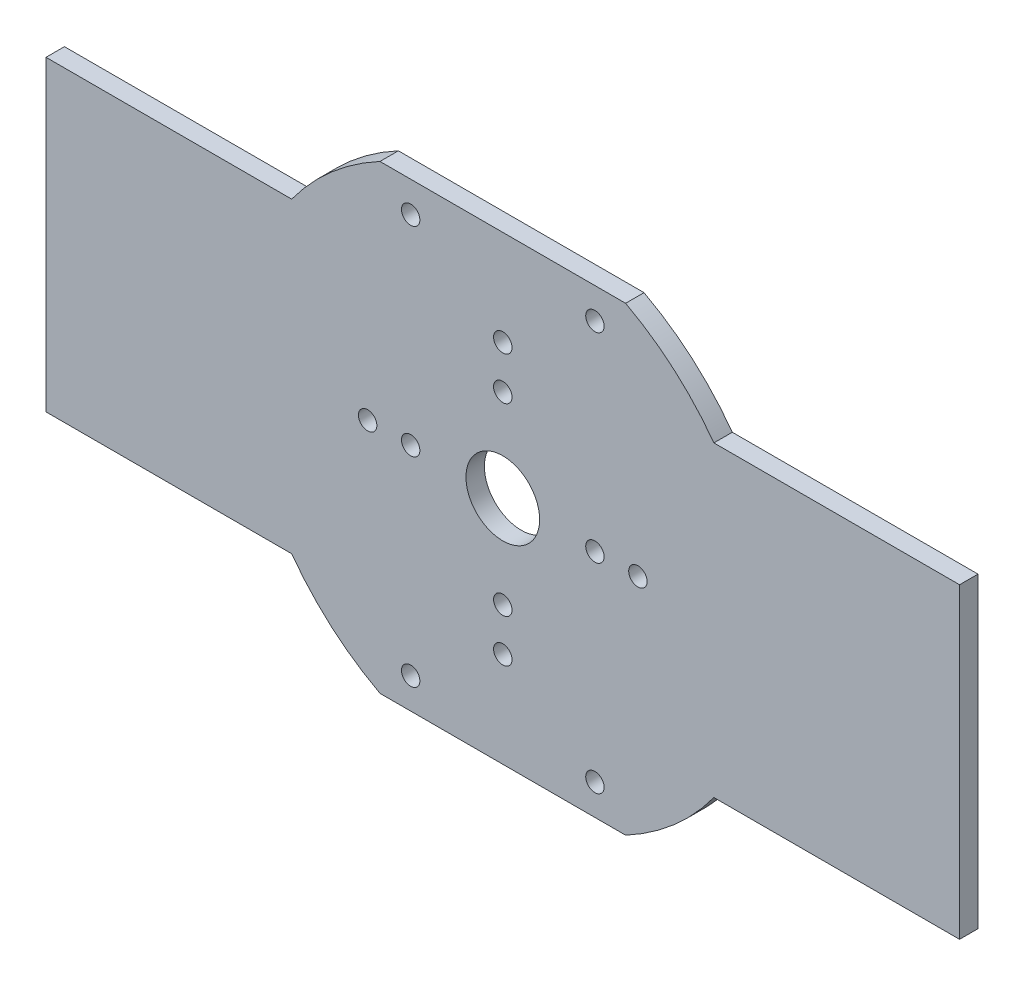
ISO-10303-21;
HEADER;
FILE_DESCRIPTION(('STEP AP214'),'2;1');
FILE_NAME('part.step','',(''),(''),'','','');
FILE_SCHEMA(('AUTOMOTIVE_DESIGN { 1 0 10303 214 1 1 1 1 }'));
ENDSEC;
DATA;
#1=APPLICATION_CONTEXT('core data for automotive mechanical design processes');
#2=APPLICATION_PROTOCOL_DEFINITION('international standard','automotive_design',2000,#1);
#3=PRODUCT_CONTEXT('',#1,'mechanical');
#4=PRODUCT('Part','Part','',(#3));
#5=PRODUCT_RELATED_PRODUCT_CATEGORY('part','',(#4));
#6=PRODUCT_DEFINITION_FORMATION('','',#4);
#7=PRODUCT_DEFINITION_CONTEXT('part definition',#1,'design');
#8=PRODUCT_DEFINITION('design','',#6,#7);
#9=PRODUCT_DEFINITION_SHAPE('','',#8);
#10=(LENGTH_UNIT() NAMED_UNIT(*) SI_UNIT(.MILLI.,.METRE.));
#11=(NAMED_UNIT(*) PLANE_ANGLE_UNIT() SI_UNIT($,.RADIAN.));
#12=(NAMED_UNIT(*) SI_UNIT($,.STERADIAN.) SOLID_ANGLE_UNIT());
#13=UNCERTAINTY_MEASURE_WITH_UNIT(LENGTH_MEASURE(1.E-05),#10,'distance_accuracy_value','');
#14=(GEOMETRIC_REPRESENTATION_CONTEXT(3) GLOBAL_UNCERTAINTY_ASSIGNED_CONTEXT((#13)) GLOBAL_UNIT_ASSIGNED_CONTEXT((#10,
#11,#12)) REPRESENTATION_CONTEXT('',''));
#15=CARTESIAN_POINT('',(0.,0.,0.));
#16=DIRECTION('',(0.,0.,1.));
#17=DIRECTION('',(1.,0.,0.));
#18=AXIS2_PLACEMENT_3D('',#15,#16,#17);
#19=CARTESIAN_POINT('',(20.,-37.5,1.5));
#20=DIRECTION('',(0.,0.,-1.));
#21=DIRECTION('',(-1.,0.,0.));
#22=AXIS2_PLACEMENT_3D('',#19,#20,#21);
#23=CYLINDRICAL_SURFACE('',#22,42.5);
#24=DIRECTION('',(0.,0.,1.));
#25=VECTOR('',#24,1.);
#26=CARTESIAN_POINT('',(-14.3693177121688,-12.5,-3.5));
#27=LINE('',#26,#25);
#28=CARTESIAN_POINT('',(-14.3693177121688,-12.5,-1.5));
#29=VERTEX_POINT('',#28);
#30=CARTESIAN_POINT('',(-14.3693177121688,-12.5,1.5));
#31=VERTEX_POINT('',#30);
#32=EDGE_CURVE('E160',#29,#31,#27,.T.);
#33=ORIENTED_EDGE('',*,*,#32,.T.);
#34=CARTESIAN_POINT('',(20.,-37.5,1.5));
#35=DIRECTION('',(0.,0.,1.));
#36=DIRECTION('',(1.,0.,0.));
#37=AXIS2_PLACEMENT_3D('',#34,#35,#36);
#38=CIRCLE('',#37,42.5);
#39=CARTESIAN_POINT('',(0.,0.,1.5));
#40=VERTEX_POINT('',#39);
#41=EDGE_CURVE('E11',#40,#31,#38,.T.);
#42=ORIENTED_EDGE('',*,*,#41,.F.);
#43=DIRECTION('',(0.,0.,1.));
#44=VECTOR('',#43,1.);
#45=CARTESIAN_POINT('',(0.,0.,-1.5));
#46=LINE('',#45,#44);
#47=CARTESIAN_POINT('',(0.,0.,-1.5));
#48=VERTEX_POINT('',#47);
#49=EDGE_CURVE('E335',#48,#40,#46,.T.);
#50=ORIENTED_EDGE('',*,*,#49,.F.);
#51=CARTESIAN_POINT('',(20.,-37.5,-1.5));
#52=DIRECTION('',(0.,0.,1.));
#53=DIRECTION('',(1.,0.,0.));
#54=AXIS2_PLACEMENT_3D('',#51,#52,#53);
#55=CIRCLE('',#54,42.5);
#56=EDGE_CURVE('E44',#48,#29,#55,.T.);
#57=ORIENTED_EDGE('',*,*,#56,.T.);
#58=EDGE_LOOP('',(#33,#42,#50,#57));
#59=FACE_BOUND('',#58,.T.);
#60=ADVANCED_FACE('F41',(#59),#23,.T.);
#61=DIRECTION('',(0.,0.,1.));
#62=VECTOR('',#61,1.);
#63=CARTESIAN_POINT('',(-14.3693177121688,-62.5,-3.5));
#64=LINE('',#63,#62);
#65=CARTESIAN_POINT('',(-14.3693177121688,-62.5,-1.5));
#66=VERTEX_POINT('',#65);
#67=CARTESIAN_POINT('',(-14.3693177121688,-62.5,1.5));
#68=VERTEX_POINT('',#67);
#69=EDGE_CURVE('E197',#66,#68,#64,.T.);
#70=ORIENTED_EDGE('',*,*,#69,.F.);
#71=CARTESIAN_POINT('',(0.,-75.,-1.5));
#72=VERTEX_POINT('',#71);
#73=EDGE_CURVE('E59',#66,#72,#55,.T.);
#74=ORIENTED_EDGE('',*,*,#73,.T.);
#75=DIRECTION('',(0.,0.,1.));
#76=VECTOR('',#75,1.);
#77=CARTESIAN_POINT('',(0.,-75.,-1.5));
#78=LINE('',#77,#76);
#79=CARTESIAN_POINT('',(0.,-75.,1.5));
#80=VERTEX_POINT('',#79);
#81=EDGE_CURVE('E317',#72,#80,#78,.T.);
#82=ORIENTED_EDGE('',*,*,#81,.T.);
#83=EDGE_CURVE('E50',#68,#80,#38,.T.);
#84=ORIENTED_EDGE('',*,*,#83,.F.);
#85=EDGE_LOOP('',(#70,#74,#82,#84));
#86=FACE_BOUND('',#85,.T.);
#87=ADVANCED_FACE('F376',(#86),#23,.T.);
#88=DIRECTION('',(0.,0.,1.));
#89=VECTOR('',#88,1.);
#90=CARTESIAN_POINT('',(54.3693177121688,-62.5,-3.5));
#91=LINE('',#90,#89);
#92=CARTESIAN_POINT('',(54.3693177121688,-62.5,-1.5));
#93=VERTEX_POINT('',#92);
#94=CARTESIAN_POINT('',(54.3693177121688,-62.5,1.5));
#95=VERTEX_POINT('',#94);
#96=EDGE_CURVE('E196',#93,#95,#91,.T.);
#97=ORIENTED_EDGE('',*,*,#96,.T.);
#98=CARTESIAN_POINT('',(40.,-75.,1.5));
#99=VERTEX_POINT('',#98);
#100=EDGE_CURVE('E52',#99,#95,#38,.T.);
#101=ORIENTED_EDGE('',*,*,#100,.F.);
#102=DIRECTION('',(0.,0.,1.));
#103=VECTOR('',#102,1.);
#104=CARTESIAN_POINT('',(40.,-75.,-1.5));
#105=LINE('',#104,#103);
#106=CARTESIAN_POINT('',(40.,-75.,-1.5));
#107=VERTEX_POINT('',#106);
#108=EDGE_CURVE('E321',#107,#99,#105,.T.);
#109=ORIENTED_EDGE('',*,*,#108,.F.);
#110=EDGE_CURVE('E348',#107,#93,#55,.T.);
#111=ORIENTED_EDGE('',*,*,#110,.T.);
#112=EDGE_LOOP('',(#97,#101,#109,#111));
#113=FACE_BOUND('',#112,.T.);
#114=ADVANCED_FACE('F357',(#113),#23,.T.);
#115=DIRECTION('',(0.,0.,1.));
#116=VECTOR('',#115,1.);
#117=CARTESIAN_POINT('',(54.3693177121688,-12.5,-3.5));
#118=LINE('',#117,#116);
#119=CARTESIAN_POINT('',(54.3693177121688,-12.5,-1.5));
#120=VERTEX_POINT('',#119);
#121=CARTESIAN_POINT('',(54.3693177121688,-12.5,1.5));
#122=VERTEX_POINT('',#121);
#123=EDGE_CURVE('E204',#120,#122,#118,.T.);
#124=ORIENTED_EDGE('',*,*,#123,.F.);
#125=CARTESIAN_POINT('',(40.,0.,-1.5));
#126=VERTEX_POINT('',#125);
#127=EDGE_CURVE('E67',#120,#126,#55,.T.);
#128=ORIENTED_EDGE('',*,*,#127,.T.);
#129=DIRECTION('',(0.,0.,1.));
#130=VECTOR('',#129,1.);
#131=CARTESIAN_POINT('',(40.,0.,-1.5));
#132=LINE('',#131,#130);
#133=CARTESIAN_POINT('',(40.,0.,1.5));
#134=VERTEX_POINT('',#133);
#135=EDGE_CURVE('E331',#126,#134,#132,.T.);
#136=ORIENTED_EDGE('',*,*,#135,.T.);
#137=EDGE_CURVE('E51',#122,#134,#38,.T.);
#138=ORIENTED_EDGE('',*,*,#137,.F.);
#139=EDGE_LOOP('',(#124,#128,#136,#138));
#140=FACE_BOUND('',#139,.T.);
#141=ADVANCED_FACE('F340',(#140),#23,.T.);
#142=CARTESIAN_POINT('',(20.,-37.5,1.5));
#143=DIRECTION('',(0.,0.,1.));
#144=DIRECTION('',(1.,0.,0.));
#145=AXIS2_PLACEMENT_3D('',#142,#143,#144);
#146=PLANE('',#145);
#147=CARTESIAN_POINT('',(20.,-37.5,1.5));
#148=DIRECTION('',(0.,0.,1.));
#149=DIRECTION('',(1.,0.,0.));
#150=AXIS2_PLACEMENT_3D('',#147,#148,#149);
#151=CIRCLE('',#150,6.);
#152=CARTESIAN_POINT('',(26.,-37.5,1.5));
#153=VERTEX_POINT('',#152);
#154=EDGE_CURVE('E201',#153,#153,#151,.T.);
#155=ORIENTED_EDGE('',*,*,#154,.F.);
#156=EDGE_LOOP('',(#155));
#157=FACE_BOUND('',#156,.T.);
#158=CARTESIAN_POINT('',(20.,-15.5,1.5));
#159=DIRECTION('',(0.,0.,1.));
#160=DIRECTION('',(1.,0.,0.));
#161=AXIS2_PLACEMENT_3D('',#158,#159,#160);
#162=CIRCLE('',#161,1.5);
#163=CARTESIAN_POINT('',(21.5,-15.5,1.5));
#164=VERTEX_POINT('',#163);
#165=EDGE_CURVE('E223',#164,#164,#162,.T.);
#166=ORIENTED_EDGE('',*,*,#165,.F.);
#167=EDGE_LOOP('',(#166));
#168=FACE_BOUND('',#167,.T.);
#169=CARTESIAN_POINT('',(35.,-37.5,1.5));
#170=DIRECTION('',(0.,0.,1.));
#171=DIRECTION('',(1.,0.,0.));
#172=AXIS2_PLACEMENT_3D('',#169,#170,#171);
#173=CIRCLE('',#172,1.5);
#174=CARTESIAN_POINT('',(36.5,-37.5,1.5));
#175=VERTEX_POINT('',#174);
#176=EDGE_CURVE('E214',#175,#175,#173,.T.);
#177=ORIENTED_EDGE('',*,*,#176,.F.);
#178=EDGE_LOOP('',(#177));
#179=FACE_BOUND('',#178,.T.);
#180=CARTESIAN_POINT('',(20.,-52.5,1.5));
#181=DIRECTION('',(0.,0.,1.));
#182=DIRECTION('',(1.,0.,0.));
#183=AXIS2_PLACEMENT_3D('',#180,#181,#182);
#184=CIRCLE('',#183,1.5);
#185=CARTESIAN_POINT('',(21.5,-52.5,1.5));
#186=VERTEX_POINT('',#185);
#187=EDGE_CURVE('E241',#186,#186,#184,.T.);
#188=ORIENTED_EDGE('',*,*,#187,.F.);
#189=EDGE_LOOP('',(#188));
#190=FACE_BOUND('',#189,.T.);
#191=CARTESIAN_POINT('',(5.,-37.5,1.5));
#192=DIRECTION('',(0.,0.,1.));
#193=DIRECTION('',(1.,0.,0.));
#194=AXIS2_PLACEMENT_3D('',#191,#192,#193);
#195=CIRCLE('',#194,1.5);
#196=CARTESIAN_POINT('',(6.5,-37.5,1.5));
#197=VERTEX_POINT('',#196);
#198=EDGE_CURVE('E233',#197,#197,#195,.T.);
#199=ORIENTED_EDGE('',*,*,#198,.F.);
#200=EDGE_LOOP('',(#199));
#201=FACE_BOUND('',#200,.T.);
#202=CARTESIAN_POINT('',(-1.99999999999999,-37.5,1.5));
#203=DIRECTION('',(0.,0.,1.));
#204=DIRECTION('',(1.,0.,0.));
#205=AXIS2_PLACEMENT_3D('',#202,#203,#204);
#206=CIRCLE('',#205,1.5);
#207=CARTESIAN_POINT('',(-0.499999999999994,-37.5,1.5));
#208=VERTEX_POINT('',#207);
#209=EDGE_CURVE('E271',#208,#208,#206,.T.);
#210=ORIENTED_EDGE('',*,*,#209,.F.);
#211=EDGE_LOOP('',(#210));
#212=FACE_BOUND('',#211,.T.);
#213=CARTESIAN_POINT('',(42.,-37.5,1.5));
#214=DIRECTION('',(0.,0.,1.));
#215=DIRECTION('',(1.,0.,0.));
#216=AXIS2_PLACEMENT_3D('',#213,#214,#215);
#217=CIRCLE('',#216,1.5);
#218=CARTESIAN_POINT('',(43.5,-37.5,1.5));
#219=VERTEX_POINT('',#218);
#220=EDGE_CURVE('E256',#219,#219,#217,.T.);
#221=ORIENTED_EDGE('',*,*,#220,.F.);
#222=EDGE_LOOP('',(#221));
#223=FACE_BOUND('',#222,.T.);
#224=CARTESIAN_POINT('',(20.,-59.5,1.5));
#225=DIRECTION('',(0.,0.,1.));
#226=DIRECTION('',(1.,0.,0.));
#227=AXIS2_PLACEMENT_3D('',#224,#225,#226);
#228=CIRCLE('',#227,1.5);
#229=CARTESIAN_POINT('',(21.5,-59.5,1.5));
#230=VERTEX_POINT('',#229);
#231=EDGE_CURVE('E257',#230,#230,#228,.T.);
#232=ORIENTED_EDGE('',*,*,#231,.F.);
#233=EDGE_LOOP('',(#232));
#234=FACE_BOUND('',#233,.T.);
#235=CARTESIAN_POINT('',(20.,-22.5,1.5));
#236=DIRECTION('',(0.,0.,1.));
#237=DIRECTION('',(1.,0.,0.));
#238=AXIS2_PLACEMENT_3D('',#235,#236,#237);
#239=CIRCLE('',#238,1.5);
#240=CARTESIAN_POINT('',(21.5,-22.5,1.5));
#241=VERTEX_POINT('',#240);
#242=EDGE_CURVE('E232',#241,#241,#239,.T.);
#243=ORIENTED_EDGE('',*,*,#242,.F.);
#244=EDGE_LOOP('',(#243));
#245=FACE_BOUND('',#244,.T.);
#246=CARTESIAN_POINT('',(35.,-70.,1.5));
#247=DIRECTION('',(0.,0.,1.));
#248=DIRECTION('',(1.,0.,0.));
#249=AXIS2_PLACEMENT_3D('',#246,#247,#248);
#250=CIRCLE('',#249,1.5);
#251=CARTESIAN_POINT('',(36.5,-70.,1.5));
#252=VERTEX_POINT('',#251);
#253=EDGE_CURVE('E222',#252,#252,#250,.T.);
#254=ORIENTED_EDGE('',*,*,#253,.F.);
#255=EDGE_LOOP('',(#254));
#256=FACE_BOUND('',#255,.T.);
#257=CARTESIAN_POINT('',(5.,-70.,1.5));
#258=DIRECTION('',(0.,0.,1.));
#259=DIRECTION('',(1.,0.,0.));
#260=AXIS2_PLACEMENT_3D('',#257,#258,#259);
#261=CIRCLE('',#260,1.5);
#262=CARTESIAN_POINT('',(6.5,-70.,1.5));
#263=VERTEX_POINT('',#262);
#264=EDGE_CURVE('E286',#263,#263,#261,.T.);
#265=ORIENTED_EDGE('',*,*,#264,.F.);
#266=EDGE_LOOP('',(#265));
#267=FACE_BOUND('',#266,.T.);
#268=CARTESIAN_POINT('',(35.,-5.,1.5));
#269=DIRECTION('',(0.,0.,1.));
#270=DIRECTION('',(1.,0.,0.));
#271=AXIS2_PLACEMENT_3D('',#268,#269,#270);
#272=CIRCLE('',#271,1.5);
#273=CARTESIAN_POINT('',(36.5,-5.,1.5));
#274=VERTEX_POINT('',#273);
#275=EDGE_CURVE('E294',#274,#274,#272,.T.);
#276=ORIENTED_EDGE('',*,*,#275,.F.);
#277=EDGE_LOOP('',(#276));
#278=FACE_BOUND('',#277,.T.);
#279=CARTESIAN_POINT('',(5.,-5.,1.5));
#280=DIRECTION('',(0.,0.,1.));
#281=DIRECTION('',(1.,0.,0.));
#282=AXIS2_PLACEMENT_3D('',#279,#280,#281);
#283=CIRCLE('',#282,1.5);
#284=CARTESIAN_POINT('',(6.5,-5.,1.5));
#285=VERTEX_POINT('',#284);
#286=EDGE_CURVE('E302',#285,#285,#283,.T.);
#287=ORIENTED_EDGE('',*,*,#286,.F.);
#288=EDGE_LOOP('',(#287));
#289=FACE_BOUND('',#288,.T.);
#290=ORIENTED_EDGE('',*,*,#41,.T.);
#291=DIRECTION('',(1.,0.,0.));
#292=VECTOR('',#291,1.);
#293=CARTESIAN_POINT('',(-54.3693177121688,-12.5,1.5));
#294=LINE('',#293,#292);
#295=CARTESIAN_POINT('',(-54.3693177121688,-12.5,1.5));
#296=VERTEX_POINT('',#295);
#297=EDGE_CURVE('E639',#296,#31,#294,.T.);
#298=ORIENTED_EDGE('',*,*,#297,.F.);
#299=DIRECTION('',(0.,1.,0.));
#300=VECTOR('',#299,1.);
#301=CARTESIAN_POINT('',(-54.3693177121688,-62.5,1.5));
#302=LINE('',#301,#300);
#303=CARTESIAN_POINT('',(-54.3693177121688,-62.5,1.5));
#304=VERTEX_POINT('',#303);
#305=EDGE_CURVE('E153',#304,#296,#302,.T.);
#306=ORIENTED_EDGE('',*,*,#305,.F.);
#307=DIRECTION('',(1.,0.,0.));
#308=VECTOR('',#307,1.);
#309=CARTESIAN_POINT('',(-54.3693177121688,-62.5,1.5));
#310=LINE('',#309,#308);
#311=EDGE_CURVE('E170',#304,#68,#310,.T.);
#312=ORIENTED_EDGE('',*,*,#311,.T.);
#313=ORIENTED_EDGE('',*,*,#83,.T.);
#314=DIRECTION('',(1.,0.,0.));
#315=VECTOR('',#314,1.);
#316=CARTESIAN_POINT('',(0.,-75.,1.5));
#317=LINE('',#316,#315);
#318=EDGE_CURVE('E310',#80,#99,#317,.T.);
#319=ORIENTED_EDGE('',*,*,#318,.T.);
#320=ORIENTED_EDGE('',*,*,#100,.T.);
#321=DIRECTION('',(-1.,0.,0.));
#322=VECTOR('',#321,1.);
#323=CARTESIAN_POINT('',(94.3693177121688,-62.5,1.5));
#324=LINE('',#323,#322);
#325=CARTESIAN_POINT('',(94.3693177121688,-62.5,1.5));
#326=VERTEX_POINT('',#325);
#327=EDGE_CURVE('E189',#326,#95,#324,.T.);
#328=ORIENTED_EDGE('',*,*,#327,.F.);
#329=DIRECTION('',(0.,-1.,0.));
#330=VECTOR('',#329,1.);
#331=CARTESIAN_POINT('',(94.3693177121688,-12.5,1.5));
#332=LINE('',#331,#330);
#333=CARTESIAN_POINT('',(94.3693177121688,-12.5,1.5));
#334=VERTEX_POINT('',#333);
#335=EDGE_CURVE('E168',#334,#326,#332,.T.);
#336=ORIENTED_EDGE('',*,*,#335,.F.);
#337=DIRECTION('',(-1.,0.,0.));
#338=VECTOR('',#337,1.);
#339=CARTESIAN_POINT('',(94.3693177121688,-12.5,1.5));
#340=LINE('',#339,#338);
#341=EDGE_CURVE('E192',#334,#122,#340,.T.);
#342=ORIENTED_EDGE('',*,*,#341,.T.);
#343=ORIENTED_EDGE('',*,*,#137,.T.);
#344=DIRECTION('',(1.,0.,0.));
#345=VECTOR('',#344,1.);
#346=CARTESIAN_POINT('',(0.,0.,1.5));
#347=LINE('',#346,#345);
#348=EDGE_CURVE('E324',#40,#134,#347,.T.);
#349=ORIENTED_EDGE('',*,*,#348,.F.);
#350=EDGE_LOOP('',(#290,#298,#306,#312,#313,#319,#320,#328,#336,#342,#343,#349));
#351=FACE_BOUND('',#350,.T.);
#352=ADVANCED_FACE('F368',(#157,#168,#179,#190,#201,#212,#223,#234,#245,#256,#267,#278,#289,
#351),#146,.T.);
#353=CARTESIAN_POINT('',(20.,-37.5,-1.5));
#354=DIRECTION('',(0.,0.,1.));
#355=DIRECTION('',(1.,0.,0.));
#356=AXIS2_PLACEMENT_3D('',#353,#354,#355);
#357=PLANE('',#356);
#358=CARTESIAN_POINT('',(20.,-37.5,-1.5));
#359=DIRECTION('',(0.,0.,1.));
#360=DIRECTION('',(1.,0.,0.));
#361=AXIS2_PLACEMENT_3D('',#358,#359,#360);
#362=CIRCLE('',#361,6.);
#363=CARTESIAN_POINT('',(26.,-37.5,-1.5));
#364=VERTEX_POINT('',#363);
#365=EDGE_CURVE('E210',#364,#364,#362,.T.);
#366=ORIENTED_EDGE('',*,*,#365,.T.);
#367=EDGE_LOOP('',(#366));
#368=FACE_BOUND('',#367,.T.);
#369=CARTESIAN_POINT('',(20.,-15.5,-1.5));
#370=DIRECTION('',(0.,0.,1.));
#371=DIRECTION('',(1.,0.,0.));
#372=AXIS2_PLACEMENT_3D('',#369,#370,#371);
#373=CIRCLE('',#372,1.5);
#374=CARTESIAN_POINT('',(21.5,-15.5,-1.5));
#375=VERTEX_POINT('',#374);
#376=EDGE_CURVE('E218',#375,#375,#373,.T.);
#377=ORIENTED_EDGE('',*,*,#376,.T.);
#378=EDGE_LOOP('',(#377));
#379=FACE_BOUND('',#378,.T.);
#380=CARTESIAN_POINT('',(35.,-37.5,-1.5));
#381=DIRECTION('',(0.,0.,1.));
#382=DIRECTION('',(1.,0.,0.));
#383=AXIS2_PLACEMENT_3D('',#380,#381,#382);
#384=CIRCLE('',#383,1.5);
#385=CARTESIAN_POINT('',(36.5,-37.5,-1.5));
#386=VERTEX_POINT('',#385);
#387=EDGE_CURVE('E245',#386,#386,#384,.T.);
#388=ORIENTED_EDGE('',*,*,#387,.T.);
#389=EDGE_LOOP('',(#388));
#390=FACE_BOUND('',#389,.T.);
#391=CARTESIAN_POINT('',(20.,-52.5,-1.5));
#392=DIRECTION('',(0.,0.,1.));
#393=DIRECTION('',(1.,0.,0.));
#394=AXIS2_PLACEMENT_3D('',#391,#392,#393);
#395=CIRCLE('',#394,1.5);
#396=CARTESIAN_POINT('',(21.5,-52.5,-1.5));
#397=VERTEX_POINT('',#396);
#398=EDGE_CURVE('E237',#397,#397,#395,.T.);
#399=ORIENTED_EDGE('',*,*,#398,.T.);
#400=EDGE_LOOP('',(#399));
#401=FACE_BOUND('',#400,.T.);
#402=CARTESIAN_POINT('',(5.,-37.5,-1.5));
#403=DIRECTION('',(0.,0.,1.));
#404=DIRECTION('',(1.,0.,0.));
#405=AXIS2_PLACEMENT_3D('',#402,#403,#404);
#406=CIRCLE('',#405,1.5);
#407=CARTESIAN_POINT('',(6.5,-37.5,-1.5));
#408=VERTEX_POINT('',#407);
#409=EDGE_CURVE('E228',#408,#408,#406,.T.);
#410=ORIENTED_EDGE('',*,*,#409,.T.);
#411=EDGE_LOOP('',(#410));
#412=FACE_BOUND('',#411,.T.);
#413=CARTESIAN_POINT('',(-1.99999999999999,-37.5,-1.5));
#414=DIRECTION('',(0.,0.,1.));
#415=DIRECTION('',(1.,0.,0.));
#416=AXIS2_PLACEMENT_3D('',#413,#414,#415);
#417=CIRCLE('',#416,1.5);
#418=CARTESIAN_POINT('',(-0.499999999999994,-37.5,-1.5));
#419=VERTEX_POINT('',#418);
#420=EDGE_CURVE('E227',#419,#419,#417,.T.);
#421=ORIENTED_EDGE('',*,*,#420,.T.);
#422=EDGE_LOOP('',(#421));
#423=FACE_BOUND('',#422,.T.);
#424=CARTESIAN_POINT('',(42.,-37.5,-1.5));
#425=DIRECTION('',(0.,0.,1.));
#426=DIRECTION('',(1.,0.,0.));
#427=AXIS2_PLACEMENT_3D('',#424,#425,#426);
#428=CIRCLE('',#427,1.5);
#429=CARTESIAN_POINT('',(43.5,-37.5,-1.5));
#430=VERTEX_POINT('',#429);
#431=EDGE_CURVE('E275',#430,#430,#428,.T.);
#432=ORIENTED_EDGE('',*,*,#431,.T.);
#433=EDGE_LOOP('',(#432));
#434=FACE_BOUND('',#433,.T.);
#435=CARTESIAN_POINT('',(20.,-59.5,-1.5));
#436=DIRECTION('',(0.,0.,1.));
#437=DIRECTION('',(1.,0.,0.));
#438=AXIS2_PLACEMENT_3D('',#435,#436,#437);
#439=CIRCLE('',#438,1.5);
#440=CARTESIAN_POINT('',(21.5,-59.5,-1.5));
#441=VERTEX_POINT('',#440);
#442=EDGE_CURVE('E252',#441,#441,#439,.T.);
#443=ORIENTED_EDGE('',*,*,#442,.T.);
#444=EDGE_LOOP('',(#443));
#445=FACE_BOUND('',#444,.T.);
#446=CARTESIAN_POINT('',(20.,-22.5,-1.5));
#447=DIRECTION('',(0.,0.,1.));
#448=DIRECTION('',(1.,0.,0.));
#449=AXIS2_PLACEMENT_3D('',#446,#447,#448);
#450=CIRCLE('',#449,1.5);
#451=CARTESIAN_POINT('',(21.5,-22.5,-1.5));
#452=VERTEX_POINT('',#451);
#453=EDGE_CURVE('E261',#452,#452,#450,.T.);
#454=ORIENTED_EDGE('',*,*,#453,.T.);
#455=EDGE_LOOP('',(#454));
#456=FACE_BOUND('',#455,.T.);
#457=CARTESIAN_POINT('',(35.,-70.,-1.5));
#458=DIRECTION('',(0.,0.,1.));
#459=DIRECTION('',(1.,0.,0.));
#460=AXIS2_PLACEMENT_3D('',#457,#458,#459);
#461=CIRCLE('',#460,1.5);
#462=CARTESIAN_POINT('',(36.5,-70.,-1.5));
#463=VERTEX_POINT('',#462);
#464=EDGE_CURVE('E282',#463,#463,#461,.T.);
#465=ORIENTED_EDGE('',*,*,#464,.T.);
#466=EDGE_LOOP('',(#465));
#467=FACE_BOUND('',#466,.T.);
#468=CARTESIAN_POINT('',(5.,-70.,-1.5));
#469=DIRECTION('',(0.,0.,1.));
#470=DIRECTION('',(1.,0.,0.));
#471=AXIS2_PLACEMENT_3D('',#468,#469,#470);
#472=CIRCLE('',#471,1.5);
#473=CARTESIAN_POINT('',(6.5,-70.,-1.5));
#474=VERTEX_POINT('',#473);
#475=EDGE_CURVE('E290',#474,#474,#472,.T.);
#476=ORIENTED_EDGE('',*,*,#475,.T.);
#477=EDGE_LOOP('',(#476));
#478=FACE_BOUND('',#477,.T.);
#479=CARTESIAN_POINT('',(35.,-5.,-1.5));
#480=DIRECTION('',(0.,0.,1.));
#481=DIRECTION('',(1.,0.,0.));
#482=AXIS2_PLACEMENT_3D('',#479,#480,#481);
#483=CIRCLE('',#482,1.5);
#484=CARTESIAN_POINT('',(36.5,-5.,-1.5));
#485=VERTEX_POINT('',#484);
#486=EDGE_CURVE('E298',#485,#485,#483,.T.);
#487=ORIENTED_EDGE('',*,*,#486,.T.);
#488=EDGE_LOOP('',(#487));
#489=FACE_BOUND('',#488,.T.);
#490=CARTESIAN_POINT('',(5.,-5.,-1.5));
#491=DIRECTION('',(0.,0.,1.));
#492=DIRECTION('',(1.,0.,0.));
#493=AXIS2_PLACEMENT_3D('',#490,#491,#492);
#494=CIRCLE('',#493,1.5);
#495=CARTESIAN_POINT('',(6.5,-5.,-1.5));
#496=VERTEX_POINT('',#495);
#497=EDGE_CURVE('E306',#496,#496,#494,.T.);
#498=ORIENTED_EDGE('',*,*,#497,.T.);
#499=EDGE_LOOP('',(#498));
#500=FACE_BOUND('',#499,.T.);
#501=ORIENTED_EDGE('',*,*,#73,.F.);
#502=DIRECTION('',(1.,0.,0.));
#503=VECTOR('',#502,1.);
#504=CARTESIAN_POINT('',(-54.3693177121688,-62.5,-1.5));
#505=LINE('',#504,#503);
#506=CARTESIAN_POINT('',(-54.3693177121688,-62.5,-1.5));
#507=VERTEX_POINT('',#506);
#508=EDGE_CURVE('E143',#507,#66,#505,.T.);
#509=ORIENTED_EDGE('',*,*,#508,.F.);
#510=DIRECTION('',(0.,-1.,0.));
#511=VECTOR('',#510,1.);
#512=CARTESIAN_POINT('',(-54.3693177121688,-12.5,-1.5));
#513=LINE('',#512,#511);
#514=CARTESIAN_POINT('',(-54.3693177121688,-12.5,-1.5));
#515=VERTEX_POINT('',#514);
#516=EDGE_CURVE('E136',#515,#507,#513,.T.);
#517=ORIENTED_EDGE('',*,*,#516,.F.);
#518=DIRECTION('',(1.,0.,0.));
#519=VECTOR('',#518,1.);
#520=CARTESIAN_POINT('',(-54.3693177121688,-12.5,-1.5));
#521=LINE('',#520,#519);
#522=EDGE_CURVE('E141',#515,#29,#521,.T.);
#523=ORIENTED_EDGE('',*,*,#522,.T.);
#524=ORIENTED_EDGE('',*,*,#56,.F.);
#525=DIRECTION('',(1.,0.,0.));
#526=VECTOR('',#525,1.);
#527=CARTESIAN_POINT('',(0.,0.,-1.5));
#528=LINE('',#527,#526);
#529=EDGE_CURVE('E327',#48,#126,#528,.T.);
#530=ORIENTED_EDGE('',*,*,#529,.T.);
#531=ORIENTED_EDGE('',*,*,#127,.F.);
#532=DIRECTION('',(-1.,0.,0.));
#533=VECTOR('',#532,1.);
#534=CARTESIAN_POINT('',(94.3693177121688,-12.5,-1.5));
#535=LINE('',#534,#533);
#536=CARTESIAN_POINT('',(94.3693177121688,-12.5,-1.5));
#537=VERTEX_POINT('',#536);
#538=EDGE_CURVE('E182',#537,#120,#535,.T.);
#539=ORIENTED_EDGE('',*,*,#538,.F.);
#540=DIRECTION('',(0.,1.,0.));
#541=VECTOR('',#540,1.);
#542=CARTESIAN_POINT('',(94.3693177121688,-62.5,-1.5));
#543=LINE('',#542,#541);
#544=CARTESIAN_POINT('',(94.3693177121688,-62.5,-1.5));
#545=VERTEX_POINT('',#544);
#546=EDGE_CURVE('E179',#545,#537,#543,.T.);
#547=ORIENTED_EDGE('',*,*,#546,.F.);
#548=DIRECTION('',(-1.,0.,0.));
#549=VECTOR('',#548,1.);
#550=CARTESIAN_POINT('',(94.3693177121688,-62.5,-1.5));
#551=LINE('',#550,#549);
#552=EDGE_CURVE('E185',#545,#93,#551,.T.);
#553=ORIENTED_EDGE('',*,*,#552,.T.);
#554=ORIENTED_EDGE('',*,*,#110,.F.);
#555=DIRECTION('',(1.,0.,0.));
#556=VECTOR('',#555,1.);
#557=CARTESIAN_POINT('',(0.,-75.,-1.5));
#558=LINE('',#557,#556);
#559=EDGE_CURVE('E314',#72,#107,#558,.T.);
#560=ORIENTED_EDGE('',*,*,#559,.F.);
#561=EDGE_LOOP('',(#501,#509,#517,#523,#524,#530,#531,#539,#547,#553,#554,#560));
#562=FACE_BOUND('',#561,.T.);
#563=ADVANCED_FACE('F138',(#368,#379,#390,#401,#412,#423,#434,#445,#456,#467,#478,#489,#500,
#562),#357,.F.);
#564=CARTESIAN_POINT('',(0.,0.,-1.5));
#565=DIRECTION('',(0.,-1.,0.));
#566=DIRECTION('',(0.,0.,-1.));
#567=AXIS2_PLACEMENT_3D('',#564,#565,#566);
#568=PLANE('',#567);
#569=ORIENTED_EDGE('',*,*,#348,.T.);
#570=ORIENTED_EDGE('',*,*,#135,.F.);
#571=ORIENTED_EDGE('',*,*,#529,.F.);
#572=ORIENTED_EDGE('',*,*,#49,.T.);
#573=EDGE_LOOP('',(#569,#570,#571,#572));
#574=FACE_BOUND('',#573,.T.);
#575=ADVANCED_FACE('F342',(#574),#568,.F.);
#576=CARTESIAN_POINT('',(0.,-75.,-1.5));
#577=DIRECTION('',(0.,-1.,0.));
#578=DIRECTION('',(0.,0.,-1.));
#579=AXIS2_PLACEMENT_3D('',#576,#577,#578);
#580=PLANE('',#579);
#581=ORIENTED_EDGE('',*,*,#318,.F.);
#582=ORIENTED_EDGE('',*,*,#81,.F.);
#583=ORIENTED_EDGE('',*,*,#559,.T.);
#584=ORIENTED_EDGE('',*,*,#108,.T.);
#585=EDGE_LOOP('',(#581,#582,#583,#584));
#586=FACE_BOUND('',#585,.T.);
#587=ADVANCED_FACE('F375',(#586),#580,.T.);
#588=CARTESIAN_POINT('',(5.,-5.,-1.5));
#589=DIRECTION('',(0.,0.,1.));
#590=DIRECTION('',(1.,0.,0.));
#591=AXIS2_PLACEMENT_3D('',#588,#589,#590);
#592=CYLINDRICAL_SURFACE('',#591,1.5);
#593=ORIENTED_EDGE('',*,*,#497,.F.);
#594=EDGE_LOOP('',(#593));
#595=FACE_BOUND('',#594,.T.);
#596=ORIENTED_EDGE('',*,*,#286,.T.);
#597=EDGE_LOOP('',(#596));
#598=FACE_BOUND('',#597,.T.);
#599=ADVANCED_FACE('F404',(#595,#598),#592,.F.);
#600=CARTESIAN_POINT('',(35.,-5.,-1.5));
#601=DIRECTION('',(0.,0.,1.));
#602=DIRECTION('',(1.,0.,0.));
#603=AXIS2_PLACEMENT_3D('',#600,#601,#602);
#604=CYLINDRICAL_SURFACE('',#603,1.5);
#605=ORIENTED_EDGE('',*,*,#486,.F.);
#606=EDGE_LOOP('',(#605));
#607=FACE_BOUND('',#606,.T.);
#608=ORIENTED_EDGE('',*,*,#275,.T.);
#609=EDGE_LOOP('',(#608));
#610=FACE_BOUND('',#609,.T.);
#611=ADVANCED_FACE('F407',(#607,#610),#604,.F.);
#612=CARTESIAN_POINT('',(5.,-70.,-1.5));
#613=DIRECTION('',(0.,0.,1.));
#614=DIRECTION('',(1.,0.,0.));
#615=AXIS2_PLACEMENT_3D('',#612,#613,#614);
#616=CYLINDRICAL_SURFACE('',#615,1.5);
#617=ORIENTED_EDGE('',*,*,#475,.F.);
#618=EDGE_LOOP('',(#617));
#619=FACE_BOUND('',#618,.T.);
#620=ORIENTED_EDGE('',*,*,#264,.T.);
#621=EDGE_LOOP('',(#620));
#622=FACE_BOUND('',#621,.T.);
#623=ADVANCED_FACE('F411',(#619,#622),#616,.F.);
#624=CARTESIAN_POINT('',(35.,-70.,-1.5));
#625=DIRECTION('',(0.,0.,1.));
#626=DIRECTION('',(1.,0.,0.));
#627=AXIS2_PLACEMENT_3D('',#624,#625,#626);
#628=CYLINDRICAL_SURFACE('',#627,1.5);
#629=ORIENTED_EDGE('',*,*,#464,.F.);
#630=EDGE_LOOP('',(#629));
#631=FACE_BOUND('',#630,.T.);
#632=ORIENTED_EDGE('',*,*,#253,.T.);
#633=EDGE_LOOP('',(#632));
#634=FACE_BOUND('',#633,.T.);
#635=ADVANCED_FACE('F415',(#631,#634),#628,.F.);
#636=CARTESIAN_POINT('',(20.,-22.5,-1.5));
#637=DIRECTION('',(0.,0.,1.));
#638=DIRECTION('',(1.,0.,0.));
#639=AXIS2_PLACEMENT_3D('',#636,#637,#638);
#640=CYLINDRICAL_SURFACE('',#639,1.5);
#641=ORIENTED_EDGE('',*,*,#453,.F.);
#642=EDGE_LOOP('',(#641));
#643=FACE_BOUND('',#642,.T.);
#644=ORIENTED_EDGE('',*,*,#242,.T.);
#645=EDGE_LOOP('',(#644));
#646=FACE_BOUND('',#645,.T.);
#647=ADVANCED_FACE('F419',(#643,#646),#640,.F.);
#648=CARTESIAN_POINT('',(20.,-59.5,-1.5));
#649=DIRECTION('',(0.,0.,1.));
#650=DIRECTION('',(1.,0.,0.));
#651=AXIS2_PLACEMENT_3D('',#648,#649,#650);
#652=CYLINDRICAL_SURFACE('',#651,1.5);
#653=ORIENTED_EDGE('',*,*,#442,.F.);
#654=EDGE_LOOP('',(#653));
#655=FACE_BOUND('',#654,.T.);
#656=ORIENTED_EDGE('',*,*,#231,.T.);
#657=EDGE_LOOP('',(#656));
#658=FACE_BOUND('',#657,.T.);
#659=ADVANCED_FACE('F425',(#655,#658),#652,.F.);
#660=CARTESIAN_POINT('',(42.,-37.5,-1.5));
#661=DIRECTION('',(0.,0.,1.));
#662=DIRECTION('',(1.,0.,0.));
#663=AXIS2_PLACEMENT_3D('',#660,#661,#662);
#664=CYLINDRICAL_SURFACE('',#663,1.5);
#665=ORIENTED_EDGE('',*,*,#431,.F.);
#666=EDGE_LOOP('',(#665));
#667=FACE_BOUND('',#666,.T.);
#668=ORIENTED_EDGE('',*,*,#220,.T.);
#669=EDGE_LOOP('',(#668));
#670=FACE_BOUND('',#669,.T.);
#671=ADVANCED_FACE('F421',(#667,#670),#664,.F.);
#672=CARTESIAN_POINT('',(-1.99999999999999,-37.5,-1.5));
#673=DIRECTION('',(0.,0.,1.));
#674=DIRECTION('',(1.,0.,0.));
#675=AXIS2_PLACEMENT_3D('',#672,#673,#674);
#676=CYLINDRICAL_SURFACE('',#675,1.5);
#677=ORIENTED_EDGE('',*,*,#420,.F.);
#678=EDGE_LOOP('',(#677));
#679=FACE_BOUND('',#678,.T.);
#680=ORIENTED_EDGE('',*,*,#209,.T.);
#681=EDGE_LOOP('',(#680));
#682=FACE_BOUND('',#681,.T.);
#683=ADVANCED_FACE('F424',(#679,#682),#676,.F.);
#684=CARTESIAN_POINT('',(5.,-37.5,-1.5));
#685=DIRECTION('',(0.,0.,1.));
#686=DIRECTION('',(1.,0.,0.));
#687=AXIS2_PLACEMENT_3D('',#684,#685,#686);
#688=CYLINDRICAL_SURFACE('',#687,1.5);
#689=ORIENTED_EDGE('',*,*,#409,.F.);
#690=EDGE_LOOP('',(#689));
#691=FACE_BOUND('',#690,.T.);
#692=ORIENTED_EDGE('',*,*,#198,.T.);
#693=EDGE_LOOP('',(#692));
#694=FACE_BOUND('',#693,.T.);
#695=ADVANCED_FACE('F429',(#691,#694),#688,.F.);
#696=CARTESIAN_POINT('',(20.,-52.5,-1.5));
#697=DIRECTION('',(0.,0.,1.));
#698=DIRECTION('',(1.,0.,0.));
#699=AXIS2_PLACEMENT_3D('',#696,#697,#698);
#700=CYLINDRICAL_SURFACE('',#699,1.5);
#701=ORIENTED_EDGE('',*,*,#398,.F.);
#702=EDGE_LOOP('',(#701));
#703=FACE_BOUND('',#702,.T.);
#704=ORIENTED_EDGE('',*,*,#187,.T.);
#705=EDGE_LOOP('',(#704));
#706=FACE_BOUND('',#705,.T.);
#707=ADVANCED_FACE('F441',(#703,#706),#700,.F.);
#708=CARTESIAN_POINT('',(35.,-37.5,-1.5));
#709=DIRECTION('',(0.,0.,1.));
#710=DIRECTION('',(1.,0.,0.));
#711=AXIS2_PLACEMENT_3D('',#708,#709,#710);
#712=CYLINDRICAL_SURFACE('',#711,1.5);
#713=ORIENTED_EDGE('',*,*,#387,.F.);
#714=EDGE_LOOP('',(#713));
#715=FACE_BOUND('',#714,.T.);
#716=ORIENTED_EDGE('',*,*,#176,.T.);
#717=EDGE_LOOP('',(#716));
#718=FACE_BOUND('',#717,.T.);
#719=ADVANCED_FACE('F437',(#715,#718),#712,.F.);
#720=CARTESIAN_POINT('',(20.,-15.5,-1.5));
#721=DIRECTION('',(0.,0.,1.));
#722=DIRECTION('',(1.,0.,0.));
#723=AXIS2_PLACEMENT_3D('',#720,#721,#722);
#724=CYLINDRICAL_SURFACE('',#723,1.5);
#725=ORIENTED_EDGE('',*,*,#376,.F.);
#726=EDGE_LOOP('',(#725));
#727=FACE_BOUND('',#726,.T.);
#728=ORIENTED_EDGE('',*,*,#165,.T.);
#729=EDGE_LOOP('',(#728));
#730=FACE_BOUND('',#729,.T.);
#731=ADVANCED_FACE('F440',(#727,#730),#724,.F.);
#732=CARTESIAN_POINT('',(20.,-37.5,-1.5));
#733=DIRECTION('',(0.,0.,1.));
#734=DIRECTION('',(1.,0.,0.));
#735=AXIS2_PLACEMENT_3D('',#732,#733,#734);
#736=CYLINDRICAL_SURFACE('',#735,6.);
#737=ORIENTED_EDGE('',*,*,#365,.F.);
#738=EDGE_LOOP('',(#737));
#739=FACE_BOUND('',#738,.T.);
#740=ORIENTED_EDGE('',*,*,#154,.T.);
#741=EDGE_LOOP('',(#740));
#742=FACE_BOUND('',#741,.T.);
#743=ADVANCED_FACE('F451',(#739,#742),#736,.F.);
#744=CARTESIAN_POINT('',(94.3693177121688,-12.5,-1.5));
#745=DIRECTION('',(0.,-1.,0.));
#746=DIRECTION('',(0.,0.,-1.));
#747=AXIS2_PLACEMENT_3D('',#744,#745,#746);
#748=PLANE('',#747);
#749=ORIENTED_EDGE('',*,*,#123,.T.);
#750=ORIENTED_EDGE('',*,*,#341,.F.);
#751=DIRECTION('',(0.,0.,1.));
#752=VECTOR('',#751,1.);
#753=CARTESIAN_POINT('',(94.3693177121688,-12.5,-1.5));
#754=LINE('',#753,#752);
#755=EDGE_CURVE('E163',#537,#334,#754,.T.);
#756=ORIENTED_EDGE('',*,*,#755,.F.);
#757=ORIENTED_EDGE('',*,*,#538,.T.);
#758=EDGE_LOOP('',(#749,#750,#756,#757));
#759=FACE_BOUND('',#758,.T.);
#760=ADVANCED_FACE('F454',(#759),#748,.F.);
#761=CARTESIAN_POINT('',(94.3693177121688,-62.5,1.5));
#762=DIRECTION('',(0.,1.,0.));
#763=DIRECTION('',(0.,0.,1.));
#764=AXIS2_PLACEMENT_3D('',#761,#762,#763);
#765=PLANE('',#764);
#766=ORIENTED_EDGE('',*,*,#96,.F.);
#767=ORIENTED_EDGE('',*,*,#552,.F.);
#768=DIRECTION('',(0.,0.,-1.));
#769=VECTOR('',#768,1.);
#770=CARTESIAN_POINT('',(94.3693177121688,-62.5,1.5));
#771=LINE('',#770,#769);
#772=EDGE_CURVE('E176',#326,#545,#771,.T.);
#773=ORIENTED_EDGE('',*,*,#772,.F.);
#774=ORIENTED_EDGE('',*,*,#327,.T.);
#775=EDGE_LOOP('',(#766,#767,#773,#774));
#776=FACE_BOUND('',#775,.T.);
#777=ADVANCED_FACE('F365',(#776),#765,.F.);
#778=CARTESIAN_POINT('',(94.3693177121688,0.,0.));
#779=DIRECTION('',(1.,0.,0.));
#780=DIRECTION('',(0.,0.,-1.));
#781=AXIS2_PLACEMENT_3D('',#778,#779,#780);
#782=PLANE('',#781);
#783=ORIENTED_EDGE('',*,*,#755,.T.);
#784=ORIENTED_EDGE('',*,*,#335,.T.);
#785=ORIENTED_EDGE('',*,*,#772,.T.);
#786=ORIENTED_EDGE('',*,*,#546,.T.);
#787=EDGE_LOOP('',(#783,#784,#785,#786));
#788=FACE_BOUND('',#787,.T.);
#789=ADVANCED_FACE('F461',(#788),#782,.T.);
#790=CARTESIAN_POINT('',(-54.3693177121688,-12.5,1.5));
#791=DIRECTION('',(0.,-1.,0.));
#792=DIRECTION('',(1.,0.,0.));
#793=AXIS2_PLACEMENT_3D('',#790,#791,#792);
#794=PLANE('',#793);
#795=ORIENTED_EDGE('',*,*,#32,.F.);
#796=ORIENTED_EDGE('',*,*,#522,.F.);
#797=DIRECTION('',(0.,0.,-1.));
#798=VECTOR('',#797,1.);
#799=CARTESIAN_POINT('',(-54.3693177121688,-12.5,1.5));
#800=LINE('',#799,#798);
#801=EDGE_CURVE('E148',#296,#515,#800,.T.);
#802=ORIENTED_EDGE('',*,*,#801,.F.);
#803=ORIENTED_EDGE('',*,*,#297,.T.);
#804=EDGE_LOOP('',(#795,#796,#802,#803));
#805=FACE_BOUND('',#804,.T.);
#806=ADVANCED_FACE('F158',(#805),#794,.F.);
#807=CARTESIAN_POINT('',(-54.3693177121688,-62.5,-1.5));
#808=DIRECTION('',(0.,1.,0.));
#809=DIRECTION('',(-1.,0.,0.));
#810=AXIS2_PLACEMENT_3D('',#807,#808,#809);
#811=PLANE('',#810);
#812=ORIENTED_EDGE('',*,*,#69,.T.);
#813=ORIENTED_EDGE('',*,*,#311,.F.);
#814=DIRECTION('',(0.,0.,1.));
#815=VECTOR('',#814,1.);
#816=CARTESIAN_POINT('',(-54.3693177121688,-62.5,-1.5));
#817=LINE('',#816,#815);
#818=EDGE_CURVE('E147',#507,#304,#817,.T.);
#819=ORIENTED_EDGE('',*,*,#818,.F.);
#820=ORIENTED_EDGE('',*,*,#508,.T.);
#821=EDGE_LOOP('',(#812,#813,#819,#820));
#822=FACE_BOUND('',#821,.T.);
#823=ADVANCED_FACE('F467',(#822),#811,.F.);
#824=CARTESIAN_POINT('',(-54.3693177121688,0.,0.));
#825=DIRECTION('',(-1.,0.,0.));
#826=DIRECTION('',(0.,-1.,0.));
#827=AXIS2_PLACEMENT_3D('',#824,#825,#826);
#828=PLANE('',#827);
#829=ORIENTED_EDGE('',*,*,#801,.T.);
#830=ORIENTED_EDGE('',*,*,#516,.T.);
#831=ORIENTED_EDGE('',*,*,#818,.T.);
#832=ORIENTED_EDGE('',*,*,#305,.T.);
#833=EDGE_LOOP('',(#829,#830,#831,#832));
#834=FACE_BOUND('',#833,.T.);
#835=ADVANCED_FACE('F151',(#834),#828,.T.);
#836=CLOSED_SHELL('',(#60,#87,#114,#141,#352,#563,#575,#587,#599,#611,#623,#635,#647,#659,#671,
#683,#695,#707,#719,#731,#743,#760,#777,#789,#806,#823,#835));
#837=MANIFOLD_SOLID_BREP('B2',#836);
#838=ADVANCED_BREP_SHAPE_REPRESENTATION('',(#18,#837),#14);
#839=SHAPE_DEFINITION_REPRESENTATION(#9,#838);
ENDSEC;
END-ISO-10303-21;
